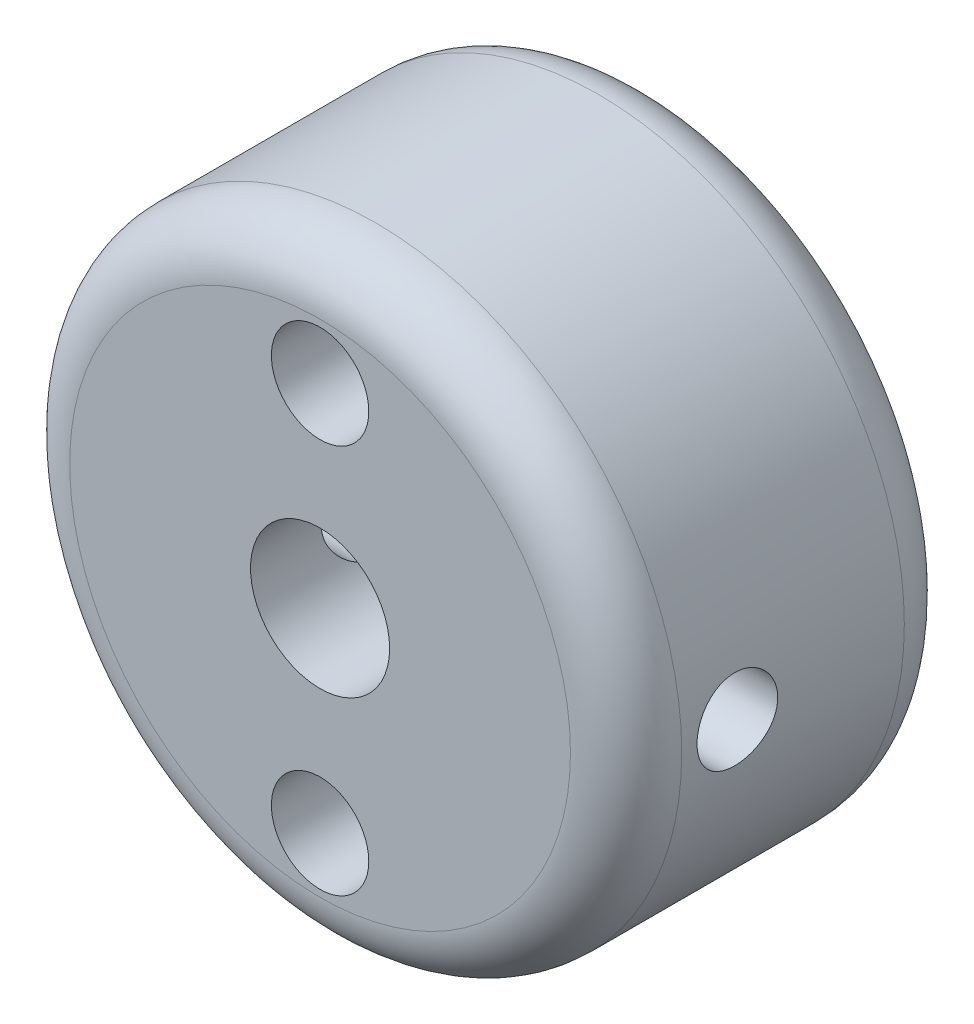
ISO-10303-21;
HEADER;
FILE_DESCRIPTION(('STEP AP214'),'2;1');
FILE_NAME('part.step','',(''),(''),'','','');
FILE_SCHEMA(('AUTOMOTIVE_DESIGN { 1 0 10303 214 1 1 1 1 }'));
ENDSEC;
DATA;
#1=APPLICATION_CONTEXT('core data for automotive mechanical design processes');
#2=APPLICATION_PROTOCOL_DEFINITION('international standard','automotive_design',2000,#1);
#3=PRODUCT_CONTEXT('',#1,'mechanical');
#4=PRODUCT('Part','Part','',(#3));
#5=PRODUCT_RELATED_PRODUCT_CATEGORY('part','',(#4));
#6=PRODUCT_DEFINITION_FORMATION('','',#4);
#7=PRODUCT_DEFINITION_CONTEXT('part definition',#1,'design');
#8=PRODUCT_DEFINITION('design','',#6,#7);
#9=PRODUCT_DEFINITION_SHAPE('','',#8);
#10=(LENGTH_UNIT() NAMED_UNIT(*) SI_UNIT(.MILLI.,.METRE.));
#11=(NAMED_UNIT(*) PLANE_ANGLE_UNIT() SI_UNIT($,.RADIAN.));
#12=(NAMED_UNIT(*) SI_UNIT($,.STERADIAN.) SOLID_ANGLE_UNIT());
#13=UNCERTAINTY_MEASURE_WITH_UNIT(LENGTH_MEASURE(1.E-05),#10,'distance_accuracy_value','');
#14=(GEOMETRIC_REPRESENTATION_CONTEXT(3) GLOBAL_UNCERTAINTY_ASSIGNED_CONTEXT((#13)) GLOBAL_UNIT_ASSIGNED_CONTEXT((#10,
#11,#12)) REPRESENTATION_CONTEXT('',''));
#15=CARTESIAN_POINT('',(0.,0.,0.));
#16=DIRECTION('',(0.,0.,1.));
#17=DIRECTION('',(1.,0.,0.));
#18=AXIS2_PLACEMENT_3D('',#15,#16,#17);
#19=CARTESIAN_POINT('',(0.,0.,12.));
#20=DIRECTION('',(0.,0.,-1.));
#21=DIRECTION('',(-1.,0.,0.));
#22=AXIS2_PLACEMENT_3D('',#19,#20,#21);
#23=CYLINDRICAL_SURFACE('',#22,11.);
#24=CARTESIAN_POINT('',(0.,0.,2.));
#25=DIRECTION('',(0.,0.,1.));
#26=DIRECTION('',(1.,0.,0.));
#27=AXIS2_PLACEMENT_3D('',#24,#25,#26);
#28=CIRCLE('',#27,11.);
#29=CARTESIAN_POINT('',(11.,0.,2.));
#30=VERTEX_POINT('',#29);
#31=EDGE_CURVE('E46',#30,#30,#28,.T.);
#32=ORIENTED_EDGE('',*,*,#31,.T.);
#33=EDGE_LOOP('',(#32));
#34=FACE_BOUND('',#33,.T.);
#35=CARTESIAN_POINT('',(0.,0.,10.));
#36=DIRECTION('',(0.,0.,1.));
#37=DIRECTION('',(1.,0.,0.));
#38=AXIS2_PLACEMENT_3D('',#35,#36,#37);
#39=CIRCLE('',#38,11.);
#40=CARTESIAN_POINT('',(11.,0.,10.));
#41=VERTEX_POINT('',#40);
#42=EDGE_CURVE('E50',#41,#41,#39,.F.);
#43=ORIENTED_EDGE('',*,*,#42,.T.);
#44=EDGE_LOOP('',(#43));
#45=FACE_BOUND('',#44,.T.);
#46=CARTESIAN_POINT('',(-11.,0.,6.55));
#47=CARTESIAN_POINT('',(-10.9999988196388,0.0810700646171393,6.55000342051961));
#48=CARTESIAN_POINT('',(-10.9990943229053,0.162189868877602,6.55682192032503));
#49=CARTESIAN_POINT('',(-10.9955731202661,0.322169605437502,6.58391315314188));
#50=CARTESIAN_POINT('',(-10.9929546573158,0.401027131913437,6.60419969300054));
#51=CARTESIAN_POINT('',(-10.9863003210212,0.554143323078767,6.65761671049998));
#52=CARTESIAN_POINT('',(-10.9822654320346,0.628405139545536,6.6907382699875));
#53=CARTESIAN_POINT('',(-10.9732262610622,0.770303018771588,6.76886501147568));
#54=CARTESIAN_POINT('',(-10.9682221372676,0.837940160051304,6.81386825467285));
#55=CARTESIAN_POINT('',(-10.9577685262702,0.965094397524424,6.91477387526258));
#56=CARTESIAN_POINT('',(-10.9523167626944,1.02456528084474,6.97073425703771));
#57=CARTESIAN_POINT('',(-10.9416005348791,1.13330064962176,7.09184100218557));
#58=CARTESIAN_POINT('',(-10.9363360804959,1.18256459863647,7.15698784806557));
#59=CARTESIAN_POINT('',(-10.9265682378684,1.26966190957159,7.29492131419906));
#60=CARTESIAN_POINT('',(-10.9220677857385,1.30745159484514,7.36773573969019));
#61=CARTESIAN_POINT('',(-10.9143678475705,1.37024869470427,7.51874678877762));
#62=CARTESIAN_POINT('',(-10.9111683067632,1.39525664741921,7.59694318562786));
#63=CARTESIAN_POINT('',(-10.9064543923123,1.43163912912521,7.75601702054221));
#64=CARTESIAN_POINT('',(-10.9049303392818,1.44309199636364,7.83687624962315));
#65=CARTESIAN_POINT('',(-10.9037104090596,1.45228167982049,7.99938226110222));
#66=CARTESIAN_POINT('',(-10.9040144503748,1.4500191074473,8.0810290082323));
#67=CARTESIAN_POINT('',(-10.9064074983364,1.43190636958793,8.24224456855266));
#68=CARTESIAN_POINT('',(-10.9084851368854,1.41614273874349,8.32182329681115));
#69=CARTESIAN_POINT('',(-10.9141735456992,1.37161048448269,8.47719608118436));
#70=CARTESIAN_POINT('',(-10.9177843501963,1.34284157068583,8.55299005275151));
#71=CARTESIAN_POINT('',(-10.9261450516096,1.27302315482551,8.69890922463832));
#72=CARTESIAN_POINT('',(-10.9308984051033,1.23193629190835,8.76901634265197));
#73=CARTESIAN_POINT('',(-10.9410059978065,1.1386749782748,8.90137349380902));
#74=CARTESIAN_POINT('',(-10.9463602675537,1.08649996395346,8.96362312730411));
#75=CARTESIAN_POINT('',(-10.9571168626766,0.972064992456455,9.0790003578433));
#76=CARTESIAN_POINT('',(-10.9625192406978,0.909730494064861,9.13205404548237));
#77=CARTESIAN_POINT('',(-10.9727248548317,0.777001989824109,9.22695708797897));
#78=CARTESIAN_POINT('',(-10.9775280892857,0.70660796166477,9.2688064118198));
#79=CARTESIAN_POINT('',(-10.9859976882221,0.559699827335735,9.34011378323897));
#80=CARTESIAN_POINT('',(-10.9896636028473,0.483183314483563,9.36956692925241));
#81=CARTESIAN_POINT('',(-10.9954415298472,0.326231477719914,9.41518578764115));
#82=CARTESIAN_POINT('',(-10.997553623177,0.245796358202938,9.43135219226844));
#83=CARTESIAN_POINT('',(-10.9999753597285,0.0839293214855447,9.44984223716992));
#84=CARTESIAN_POINT('',(-11.0002982527661,0.0025092190009183,9.45226763863529));
#85=CARTESIAN_POINT('',(-10.9991410564284,-0.159576341881272,9.44347577522623));
#86=CARTESIAN_POINT('',(-10.9976610098596,-0.240241818149795,9.43225883425634));
#87=CARTESIAN_POINT('',(-10.9930724672379,-0.398226029883761,9.39658525683905));
#88=CARTESIAN_POINT('',(-10.9899699737374,-0.475555971843567,9.37217741160519));
#89=CARTESIAN_POINT('',(-10.9824837081492,-0.625025328682233,9.31086578614261));
#90=CARTESIAN_POINT('',(-10.9780998881678,-0.697164549415324,9.27396153881192));
#91=CARTESIAN_POINT('',(-10.9685062679801,-0.834657390373671,9.18846039037535));
#92=CARTESIAN_POINT('',(-10.9632918985135,-0.899969953544018,9.13979798782221));
#93=CARTESIAN_POINT('',(-10.9526340584351,-1.02153712511859,9.03225416318574));
#94=CARTESIAN_POINT('',(-10.9471905776756,-1.07779133177993,8.97337228810392));
#95=CARTESIAN_POINT('',(-10.9366468548114,-1.1800083558422,8.84661145626795));
#96=CARTESIAN_POINT('',(-10.9315490130966,-1.22590351912656,8.77867771571363));
#97=CARTESIAN_POINT('',(-10.9223140367197,-1.30563155012618,8.63600606279097));
#98=CARTESIAN_POINT('',(-10.9181768810082,-1.33946468213883,8.56126829955414));
#99=CARTESIAN_POINT('',(-10.9113483388595,-1.39399990531041,8.40732418761388));
#100=CARTESIAN_POINT('',(-10.9086528277334,-1.41473948946965,8.3281313117656));
#101=CARTESIAN_POINT('',(-10.9050011700211,-1.44261930498135,8.16734898032797));
#102=CARTESIAN_POINT('',(-10.9040449326706,-1.44976024598175,8.08575965002372));
#103=CARTESIAN_POINT('',(-10.9039829338122,-1.45022606159318,7.92317378599637));
#104=CARTESIAN_POINT('',(-10.9048629343521,-1.4436572398525,7.84217754184687));
#105=CARTESIAN_POINT('',(-10.9083435624851,-1.41711579165026,7.6824513797019));
#106=CARTESIAN_POINT('',(-10.9109441895948,-1.39714316895594,7.60372146106946));
#107=CARTESIAN_POINT('',(-10.9175684950974,-1.34439544632631,7.4507807749069));
#108=CARTESIAN_POINT('',(-10.9215915378437,-1.31162606430288,7.37656800609609));
#109=CARTESIAN_POINT('',(-10.9306083506385,-1.23422547164092,7.23467717142674));
#110=CARTESIAN_POINT('',(-10.9356021382087,-1.18959404689068,7.1669992235528));
#111=CARTESIAN_POINT('',(-10.9460440978656,-1.08934387085847,7.03955651235548));
#112=CARTESIAN_POINT('',(-10.9514953687448,-1.03364599113853,6.97985424254895));
#113=CARTESIAN_POINT('',(-10.96221108401,-0.913009987436894,6.87060382925458));
#114=CARTESIAN_POINT('',(-10.9674754842283,-0.848069696902254,6.82105807326282));
#115=CARTESIAN_POINT('',(-10.9772491210592,-0.710475153456872,6.7333462763053));
#116=CARTESIAN_POINT('',(-10.9817550751133,-0.637789486027496,6.69522916983561));
#117=CARTESIAN_POINT('',(-10.9894712322809,-0.48702809962841,6.63179768741467));
#118=CARTESIAN_POINT('',(-10.992682825891,-0.408958270914869,6.60646956516244));
#119=CARTESIAN_POINT('',(-10.9966846065157,-0.275414672613428,6.57531766397778));
#120=CARTESIAN_POINT('',(-10.9979217393459,-0.220778830682095,6.56583740166495));
#121=CARTESIAN_POINT('',(-10.9995798358821,-0.110769729790444,6.55317742793763));
#122=CARTESIAN_POINT('',(-11.0000008065597,-0.0553964771331876,6.54999766270402));
#123=CARTESIAN_POINT('',(-11.,0.,6.55));
#124=B_SPLINE_CURVE_WITH_KNOTS('',3,(#46,#47,#48,#49,#50,#51,#52,#53,#54,#55,#56,#57,#58,#59,
#60,#61,#62,#63,#64,#65,#66,#67,#68,#69,#70,#71,#72,#73,#74,#75,#76,#77,#78,#79,#80,#81,#82,#83,
#84,#85,#86,#87,#88,#89,#90,#91,#92,#93,#94,#95,#96,#97,#98,#99,#100,#101,#102,#103,#104,#105,
#106,#107,#108,#109,#110,#111,#112,#113,#114,#115,#116,#117,#118,#119,#120,#121,#122,#123),
.UNSPECIFIED.,.T.,.F.,(4,2,2,2,2,2,2,2,2,2,2,2,2,2,2,2,2,2,2,2,2,2,2,2,2,2,2,2,2,2,2,2,2,2,2,2,
2,2,4),(0.,0.243007828473049,0.4862651634519,0.729353778194148,0.972402751241188,
1.21677495909267,1.46116000706599,1.70646396695275,1.95175759833839,2.19562658431033,
2.43948469914337,2.68179141020091,2.92410353172262,3.16715816197606,3.41022514952563,
3.65516324515727,3.90010201883658,4.14513755281857,4.39016031940414,4.63336613485026,
4.87656617607309,5.1188727521352,5.3611883863547,5.60488634486559,5.84859510853436,
6.09385220859557,6.33910393437143,6.58365016502282,6.82818363362987,7.07082806913886,
7.31347243645079,7.55600850802209,7.79854895770433,8.04289046043343,8.28728933492577,
8.53272018932119,8.77788667661282,8.94393924693374,9.10999039882029),.UNSPECIFIED.);
#125=CARTESIAN_POINT('',(-11.,0.,6.55));
#126=VERTEX_POINT('',#125);
#127=EDGE_CURVE('E90',#126,#126,#124,.T.);
#128=ORIENTED_EDGE('',*,*,#127,.T.);
#129=EDGE_LOOP('',(#128));
#130=FACE_BOUND('',#129,.T.);
#131=CARTESIAN_POINT('',(11.,0.,6.55));
#132=CARTESIAN_POINT('',(10.9999988196388,-0.0810700646171393,6.55000342051961));
#133=CARTESIAN_POINT('',(10.9990943229053,-0.162189868877602,6.55682192032503));
#134=CARTESIAN_POINT('',(10.9955731202661,-0.322169605437502,6.58391315314188));
#135=CARTESIAN_POINT('',(10.9929546573158,-0.401027131913437,6.60419969300054));
#136=CARTESIAN_POINT('',(10.9863003210212,-0.554143323078767,6.65761671049998));
#137=CARTESIAN_POINT('',(10.9822654320346,-0.628405139545536,6.6907382699875));
#138=CARTESIAN_POINT('',(10.9732262610622,-0.770303018771588,6.76886501147568));
#139=CARTESIAN_POINT('',(10.9682221372676,-0.837940160051304,6.81386825467285));
#140=CARTESIAN_POINT('',(10.9577685262702,-0.965094397524424,6.91477387526258));
#141=CARTESIAN_POINT('',(10.9523167626944,-1.02456528084474,6.97073425703771));
#142=CARTESIAN_POINT('',(10.9416005348791,-1.13330064962176,7.09184100218557));
#143=CARTESIAN_POINT('',(10.9363360804959,-1.18256459863647,7.15698784806557));
#144=CARTESIAN_POINT('',(10.9265682378684,-1.26966190957159,7.29492131419906));
#145=CARTESIAN_POINT('',(10.9220677857385,-1.30745159484514,7.36773573969019));
#146=CARTESIAN_POINT('',(10.9143678475705,-1.37024869470427,7.51874678877762));
#147=CARTESIAN_POINT('',(10.9111683067632,-1.39525664741921,7.59694318562786));
#148=CARTESIAN_POINT('',(10.9064543923123,-1.43163912912521,7.75601702054221));
#149=CARTESIAN_POINT('',(10.9049303392818,-1.44309199636364,7.83687624962315));
#150=CARTESIAN_POINT('',(10.9037104090596,-1.45228167982049,7.99938226110222));
#151=CARTESIAN_POINT('',(10.9040144503748,-1.4500191074473,8.0810290082323));
#152=CARTESIAN_POINT('',(10.9064074983364,-1.43190636958793,8.24224456855266));
#153=CARTESIAN_POINT('',(10.9084851368854,-1.41614273874349,8.32182329681115));
#154=CARTESIAN_POINT('',(10.9141735456992,-1.37161048448269,8.47719608118436));
#155=CARTESIAN_POINT('',(10.9177843501963,-1.34284157068583,8.55299005275151));
#156=CARTESIAN_POINT('',(10.9261450516096,-1.27302315482551,8.69890922463832));
#157=CARTESIAN_POINT('',(10.9308984051033,-1.23193629190835,8.76901634265197));
#158=CARTESIAN_POINT('',(10.9410059978065,-1.1386749782748,8.90137349380902));
#159=CARTESIAN_POINT('',(10.9463602675537,-1.08649996395346,8.96362312730411));
#160=CARTESIAN_POINT('',(10.9571168626766,-0.972064992456455,9.0790003578433));
#161=CARTESIAN_POINT('',(10.9625192406978,-0.909730494064861,9.13205404548237));
#162=CARTESIAN_POINT('',(10.9727248548317,-0.777001989824109,9.22695708797897));
#163=CARTESIAN_POINT('',(10.9775280892857,-0.70660796166477,9.2688064118198));
#164=CARTESIAN_POINT('',(10.9859976882221,-0.559699827335735,9.34011378323897));
#165=CARTESIAN_POINT('',(10.9896636028473,-0.483183314483563,9.36956692925241));
#166=CARTESIAN_POINT('',(10.9954415298472,-0.326231477719914,9.41518578764115));
#167=CARTESIAN_POINT('',(10.997553623177,-0.245796358202938,9.43135219226844));
#168=CARTESIAN_POINT('',(10.9999753597285,-0.0839293214855447,9.44984223716992));
#169=CARTESIAN_POINT('',(11.0002982527661,-0.0025092190009183,9.45226763863529));
#170=CARTESIAN_POINT('',(10.9991410564284,0.159576341881272,9.44347577522623));
#171=CARTESIAN_POINT('',(10.9976610098596,0.240241818149795,9.43225883425634));
#172=CARTESIAN_POINT('',(10.9930724672379,0.398226029883761,9.39658525683905));
#173=CARTESIAN_POINT('',(10.9899699737374,0.475555971843567,9.37217741160519));
#174=CARTESIAN_POINT('',(10.9824837081492,0.625025328682233,9.31086578614261));
#175=CARTESIAN_POINT('',(10.9780998881678,0.697164549415324,9.27396153881192));
#176=CARTESIAN_POINT('',(10.9685062679801,0.834657390373671,9.18846039037535));
#177=CARTESIAN_POINT('',(10.9632918985135,0.899969953544018,9.13979798782221));
#178=CARTESIAN_POINT('',(10.9526340584351,1.02153712511859,9.03225416318574));
#179=CARTESIAN_POINT('',(10.9471905776756,1.07779133177993,8.97337228810392));
#180=CARTESIAN_POINT('',(10.9366468548114,1.1800083558422,8.84661145626795));
#181=CARTESIAN_POINT('',(10.9315490130966,1.22590351912656,8.77867771571363));
#182=CARTESIAN_POINT('',(10.9223140367197,1.30563155012618,8.63600606279097));
#183=CARTESIAN_POINT('',(10.9181768810082,1.33946468213883,8.56126829955414));
#184=CARTESIAN_POINT('',(10.9113483388595,1.39399990531041,8.40732418761388));
#185=CARTESIAN_POINT('',(10.9086528277334,1.41473948946965,8.3281313117656));
#186=CARTESIAN_POINT('',(10.9050011700211,1.44261930498135,8.16734898032797));
#187=CARTESIAN_POINT('',(10.9040449326706,1.44976024598175,8.08575965002372));
#188=CARTESIAN_POINT('',(10.9039829338122,1.45022606159318,7.92317378599637));
#189=CARTESIAN_POINT('',(10.9048629343521,1.4436572398525,7.84217754184687));
#190=CARTESIAN_POINT('',(10.9083435624851,1.41711579165026,7.6824513797019));
#191=CARTESIAN_POINT('',(10.9109441895948,1.39714316895594,7.60372146106946));
#192=CARTESIAN_POINT('',(10.9175684950974,1.34439544632631,7.4507807749069));
#193=CARTESIAN_POINT('',(10.9215915378437,1.31162606430288,7.37656800609609));
#194=CARTESIAN_POINT('',(10.9306083506385,1.23422547164092,7.23467717142674));
#195=CARTESIAN_POINT('',(10.9356021382087,1.18959404689068,7.1669992235528));
#196=CARTESIAN_POINT('',(10.9460440978656,1.08934387085847,7.03955651235548));
#197=CARTESIAN_POINT('',(10.9514953687448,1.03364599113853,6.97985424254895));
#198=CARTESIAN_POINT('',(10.96221108401,0.913009987436894,6.87060382925458));
#199=CARTESIAN_POINT('',(10.9674754842283,0.848069696902254,6.82105807326282));
#200=CARTESIAN_POINT('',(10.9772491210592,0.710475153456872,6.7333462763053));
#201=CARTESIAN_POINT('',(10.9817550751133,0.637789486027496,6.69522916983561));
#202=CARTESIAN_POINT('',(10.9894712322809,0.48702809962841,6.63179768741467));
#203=CARTESIAN_POINT('',(10.992682825891,0.408958270914869,6.60646956516244));
#204=CARTESIAN_POINT('',(10.9966846065157,0.275414672613428,6.57531766397778));
#205=CARTESIAN_POINT('',(10.9979217393459,0.220778830682095,6.56583740166495));
#206=CARTESIAN_POINT('',(10.9995798358821,0.110769729790444,6.55317742793763));
#207=CARTESIAN_POINT('',(11.0000008065597,0.0553964771331876,6.54999766270402));
#208=CARTESIAN_POINT('',(11.,0.,6.55));
#209=B_SPLINE_CURVE_WITH_KNOTS('',3,(#131,#132,#133,#134,#135,#136,#137,#138,#139,#140,#141,
#142,#143,#144,#145,#146,#147,#148,#149,#150,#151,#152,#153,#154,#155,#156,#157,#158,#159,#160,
#161,#162,#163,#164,#165,#166,#167,#168,#169,#170,#171,#172,#173,#174,#175,#176,#177,#178,#179,
#180,#181,#182,#183,#184,#185,#186,#187,#188,#189,#190,#191,#192,#193,#194,#195,#196,#197,#198,
#199,#200,#201,#202,#203,#204,#205,#206,#207,#208),.UNSPECIFIED.,.T.,.F.,(4,2,2,2,2,2,2,2,2,2,2,
2,2,2,2,2,2,2,2,2,2,2,2,2,2,2,2,2,2,2,2,2,2,2,2,2,2,2,4),(0.,0.243007828473049,0.4862651634519,
0.729353778194148,0.972402751241188,1.21677495909267,1.46116000706599,1.70646396695275,
1.95175759833839,2.19562658431033,2.43948469914337,2.68179141020091,2.92410353172262,
3.16715816197606,3.41022514952563,3.65516324515727,3.90010201883658,4.14513755281857,
4.39016031940414,4.63336613485026,4.87656617607309,5.1188727521352,5.3611883863547,
5.60488634486559,5.84859510853436,6.09385220859557,6.33910393437143,6.58365016502282,
6.82818363362987,7.07082806913886,7.31347243645079,7.55600850802209,7.79854895770433,
8.04289046043343,8.28728933492577,8.53272018932119,8.77788667661282,8.94393924693374,
9.10999039882029),.UNSPECIFIED.);
#210=CARTESIAN_POINT('',(11.,0.,6.55));
#211=VERTEX_POINT('',#210);
#212=EDGE_CURVE('E64',#211,#211,#209,.T.);
#213=ORIENTED_EDGE('',*,*,#212,.T.);
#214=EDGE_LOOP('',(#213));
#215=FACE_BOUND('',#214,.T.);
#216=ADVANCED_FACE('F35',(#34,#45,#130,#215),#23,.T.);
#217=CARTESIAN_POINT('',(0.,0.,12.));
#218=DIRECTION('',(0.,0.,1.));
#219=DIRECTION('',(1.,0.,0.));
#220=AXIS2_PLACEMENT_3D('',#217,#218,#219);
#221=PLANE('',#220);
#222=CARTESIAN_POINT('',(0.,0.,12.));
#223=DIRECTION('',(0.,0.,1.));
#224=DIRECTION('',(1.,0.,0.));
#225=AXIS2_PLACEMENT_3D('',#222,#223,#224);
#226=CIRCLE('',#225,9.);
#227=CARTESIAN_POINT('',(9.,0.,12.));
#228=VERTEX_POINT('',#227);
#229=EDGE_CURVE('E11',#228,#228,#226,.T.);
#230=ORIENTED_EDGE('',*,*,#229,.T.);
#231=EDGE_LOOP('',(#230));
#232=FACE_BOUND('',#231,.T.);
#233=CARTESIAN_POINT('',(0.,0.,12.));
#234=DIRECTION('',(0.,0.,1.));
#235=DIRECTION('',(1.,0.,0.));
#236=AXIS2_PLACEMENT_3D('',#233,#234,#235);
#237=CIRCLE('',#236,2.5);
#238=CARTESIAN_POINT('',(2.5,0.,12.));
#239=VERTEX_POINT('',#238);
#240=EDGE_CURVE('E123',#239,#239,#237,.T.);
#241=ORIENTED_EDGE('',*,*,#240,.F.);
#242=EDGE_LOOP('',(#241));
#243=FACE_BOUND('',#242,.T.);
#244=CARTESIAN_POINT('',(0.,7.,12.));
#245=DIRECTION('',(0.,0.,1.));
#246=DIRECTION('',(1.,0.,0.));
#247=AXIS2_PLACEMENT_3D('',#244,#245,#246);
#248=CIRCLE('',#247,1.75);
#249=CARTESIAN_POINT('',(1.75,7.,12.));
#250=VERTEX_POINT('',#249);
#251=EDGE_CURVE('E134',#250,#250,#248,.T.);
#252=ORIENTED_EDGE('',*,*,#251,.F.);
#253=EDGE_LOOP('',(#252));
#254=FACE_BOUND('',#253,.T.);
#255=CARTESIAN_POINT('',(0.,-7.,12.));
#256=DIRECTION('',(0.,0.,1.));
#257=DIRECTION('',(1.,0.,0.));
#258=AXIS2_PLACEMENT_3D('',#255,#256,#257);
#259=CIRCLE('',#258,1.75);
#260=CARTESIAN_POINT('',(1.75,-7.,12.));
#261=VERTEX_POINT('',#260);
#262=EDGE_CURVE('E129',#261,#261,#259,.T.);
#263=ORIENTED_EDGE('',*,*,#262,.F.);
#264=EDGE_LOOP('',(#263));
#265=FACE_BOUND('',#264,.T.);
#266=ADVANCED_FACE('F98',(#232,#243,#254,#265),#221,.T.);
#267=CARTESIAN_POINT('',(0.,0.,0.));
#268=DIRECTION('',(0.,0.,1.));
#269=DIRECTION('',(1.,0.,0.));
#270=AXIS2_PLACEMENT_3D('',#267,#268,#269);
#271=PLANE('',#270);
#272=CARTESIAN_POINT('',(0.,0.,0.));
#273=DIRECTION('',(0.,0.,1.));
#274=DIRECTION('',(1.,0.,0.));
#275=AXIS2_PLACEMENT_3D('',#272,#273,#274);
#276=CIRCLE('',#275,9.);
#277=CARTESIAN_POINT('',(9.,0.,0.));
#278=VERTEX_POINT('',#277);
#279=EDGE_CURVE('E42',#278,#278,#276,.F.);
#280=ORIENTED_EDGE('',*,*,#279,.T.);
#281=EDGE_LOOP('',(#280));
#282=FACE_BOUND('',#281,.T.);
#283=CARTESIAN_POINT('',(0.,7.,0.));
#284=DIRECTION('',(0.,0.,1.));
#285=DIRECTION('',(1.,0.,0.));
#286=AXIS2_PLACEMENT_3D('',#283,#284,#285);
#287=CIRCLE('',#286,1.75);
#288=CARTESIAN_POINT('',(1.75,7.,0.));
#289=VERTEX_POINT('',#288);
#290=EDGE_CURVE('E55',#289,#289,#287,.T.);
#291=ORIENTED_EDGE('',*,*,#290,.T.);
#292=EDGE_LOOP('',(#291));
#293=FACE_BOUND('',#292,.T.);
#294=CARTESIAN_POINT('',(0.,-7.,0.));
#295=DIRECTION('',(0.,0.,1.));
#296=DIRECTION('',(1.,0.,0.));
#297=AXIS2_PLACEMENT_3D('',#294,#295,#296);
#298=CIRCLE('',#297,1.75);
#299=CARTESIAN_POINT('',(1.75,-7.,0.));
#300=VERTEX_POINT('',#299);
#301=EDGE_CURVE('E137',#300,#300,#298,.T.);
#302=ORIENTED_EDGE('',*,*,#301,.T.);
#303=EDGE_LOOP('',(#302));
#304=FACE_BOUND('',#303,.T.);
#305=ADVANCED_FACE('F100',(#282,#293,#304),#271,.F.);
#306=CARTESIAN_POINT('',(0.,-7.,0.));
#307=DIRECTION('',(0.,0.,1.));
#308=DIRECTION('',(1.,0.,0.));
#309=AXIS2_PLACEMENT_3D('',#306,#307,#308);
#310=CYLINDRICAL_SURFACE('',#309,1.75);
#311=ORIENTED_EDGE('',*,*,#301,.F.);
#312=EDGE_LOOP('',(#311));
#313=FACE_BOUND('',#312,.T.);
#314=ORIENTED_EDGE('',*,*,#262,.T.);
#315=EDGE_LOOP('',(#314));
#316=FACE_BOUND('',#315,.T.);
#317=ADVANCED_FACE('F142',(#313,#316),#310,.F.);
#318=CARTESIAN_POINT('',(0.,7.,0.));
#319=DIRECTION('',(0.,0.,1.));
#320=DIRECTION('',(1.,0.,0.));
#321=AXIS2_PLACEMENT_3D('',#318,#319,#320);
#322=CYLINDRICAL_SURFACE('',#321,1.75);
#323=ORIENTED_EDGE('',*,*,#290,.F.);
#324=EDGE_LOOP('',(#323));
#325=FACE_BOUND('',#324,.T.);
#326=ORIENTED_EDGE('',*,*,#251,.T.);
#327=EDGE_LOOP('',(#326));
#328=FACE_BOUND('',#327,.T.);
#329=ADVANCED_FACE('F151',(#325,#328),#322,.F.);
#330=CARTESIAN_POINT('',(0.,0.,-7.07106781186547));
#331=DIRECTION('',(0.,0.,1.));
#332=DIRECTION('',(1.,0.,0.));
#333=AXIS2_PLACEMENT_3D('',#330,#331,#332);
#334=CYLINDRICAL_SURFACE('',#333,2.5);
#335=CARTESIAN_POINT('',(2.5,0.,6.55));
#336=CARTESIAN_POINT('',(2.49999608878618,0.0745983864942306,6.55000432696253));
#337=CARTESIAN_POINT('',(2.49662457567457,0.149313220442496,6.55579613762605));
#338=CARTESIAN_POINT('',(2.48346046339436,0.296504145264797,6.57867651490273));
#339=CARTESIAN_POINT('',(2.47365256454314,0.368974469890021,6.59579199937478));
#340=CARTESIAN_POINT('',(2.4486156545862,0.509248557083119,6.64038375893058));
#341=CARTESIAN_POINT('',(2.43341244952313,0.577072731220503,6.66781074998979));
#342=CARTESIAN_POINT('',(2.39889951819023,0.706968172974679,6.73195100062432));
#343=CARTESIAN_POINT('',(2.37959072338244,0.769040740917357,6.76866215419808));
#344=CARTESIAN_POINT('',(2.33685317235166,0.890832083619935,6.85334498058178));
#345=CARTESIAN_POINT('',(2.31322587824492,0.950042239373606,6.90194612360602));
#346=CARTESIAN_POINT('',(2.26496878972705,1.05996612005899,7.00763133234899));
#347=CARTESIAN_POINT('',(2.24033782242608,1.11066952826846,7.06472554220365));
#348=CARTESIAN_POINT('',(2.18957706579264,1.20792647957687,7.19338263143274));
#349=CARTESIAN_POINT('',(2.1635915191164,1.25336712430616,7.2658510836036));
#350=CARTESIAN_POINT('',(2.11657608479705,1.33123443984171,7.41891706136172));
#351=CARTESIAN_POINT('',(2.0955385515577,1.3636812437859,7.49950176693018));
#352=CARTESIAN_POINT('',(2.06580519081686,1.40818885397949,7.64777942805405));
#353=CARTESIAN_POINT('',(2.05539100837257,1.42320701480874,7.71423928479686));
#354=CARTESIAN_POINT('',(2.04101324301713,1.44375517427719,7.84926577655831));
#355=CARTESIAN_POINT('',(2.03704242743126,1.44929581180854,7.91782996122389));
#356=CARTESIAN_POINT('',(2.03612922095662,1.45057879307477,8.05520174108938));
#357=CARTESIAN_POINT('',(2.03919757736047,1.44630615404806,8.12400954813123));
#358=CARTESIAN_POINT('',(2.05192272478615,1.42819113507736,8.25974212131952));
#359=CARTESIAN_POINT('',(2.0615841785778,1.41434198233984,8.32666551987353));
#360=CARTESIAN_POINT('',(2.0861183536392,1.37789078204817,8.45655622675065));
#361=CARTESIAN_POINT('',(2.10095763601946,1.35534480311269,8.51954593312966));
#362=CARTESIAN_POINT('',(2.13424607783604,1.30229503426013,8.64103603251607));
#363=CARTESIAN_POINT('',(2.15269660122682,1.2717882361111,8.69953471761971));
#364=CARTESIAN_POINT('',(2.19480545542998,1.19788106725762,8.82061331348097));
#365=CARTESIAN_POINT('',(2.21882103285047,1.15318469222408,8.8822787585875));
#366=CARTESIAN_POINT('',(2.26725108306482,1.05479107399041,8.99783906376126));
#367=CARTESIAN_POINT('',(2.29166589153013,1.00108586350441,9.0517269663022));
#368=CARTESIAN_POINT('',(2.34163790885507,0.878422476840313,9.15678661379245));
#369=CARTESIAN_POINT('',(2.36697530758474,0.808404714600064,9.20683880259807));
#370=CARTESIAN_POINT('',(2.41272802094265,0.659395036320358,9.29427373148467));
#371=CARTESIAN_POINT('',(2.43314632659228,0.580408616823397,9.33166417609304));
#372=CARTESIAN_POINT('',(2.46551508620011,0.421164732532883,9.38989541954025));
#373=CARTESIAN_POINT('',(2.47794530595015,0.341355493071077,9.41168540970715));
#374=CARTESIAN_POINT('',(2.49496618851793,0.178405336293742,9.441356601549));
#375=CARTESIAN_POINT('',(2.49956505369197,0.0952679982998283,9.44925235597334));
#376=CARTESIAN_POINT('',(2.50032562577934,-0.0606624733643608,9.450559443564));
#377=CARTESIAN_POINT('',(2.49747452256236,-0.133443272000073,9.44566551582712));
#378=CARTESIAN_POINT('',(2.48565425030567,-0.276956086320476,9.42514836995409));
#379=CARTESIAN_POINT('',(2.47668503580421,-0.347688086777123,9.40952507209135));
#380=CARTESIAN_POINT('',(2.45361801789569,-0.484244934779021,9.36858369419832));
#381=CARTESIAN_POINT('',(2.43959467166841,-0.550125105936233,9.34340609637713));
#382=CARTESIAN_POINT('',(2.40754563527269,-0.676753391567145,9.28428664716367));
#383=CARTESIAN_POINT('',(2.38951903730118,-0.737500337677504,9.25034280759723));
#384=CARTESIAN_POINT('',(2.34876399274994,-0.858968918084638,9.1706772366594));
#385=CARTESIAN_POINT('',(2.32574125691677,-0.91902723088376,9.12409638571248));
#386=CARTESIAN_POINT('',(2.27834670397906,-1.03094047928564,9.02244174508993));
#387=CARTESIAN_POINT('',(2.25397334476034,-1.08278576561096,8.96735811347785));
#388=CARTESIAN_POINT('',(2.20317555091673,-1.18301684659096,8.84267436018118));
#389=CARTESIAN_POINT('',(2.17684586935574,-1.23028355632097,8.77212937278884));
#390=CARTESIAN_POINT('',(2.12846294684293,-1.31221835722543,8.62274842502313));
#391=CARTESIAN_POINT('',(2.10640432096765,-1.34690236147371,8.54392310054492));
#392=CARTESIAN_POINT('',(2.07400282763602,-1.39613323776793,8.39740701719303));
#393=CARTESIAN_POINT('',(2.06216072072272,-1.41340635178387,8.33096614344601));
#394=CARTESIAN_POINT('',(2.0448094132648,-1.43839944471993,8.19553525961715));
#395=CARTESIAN_POINT('',(2.03929252620778,-1.4461310195523,8.12654844890801));
#396=CARTESIAN_POINT('',(2.03539456478689,-1.45161381431829,7.98779709338589));
#397=CARTESIAN_POINT('',(2.0370312270633,-1.44934022717628,7.9180310437305));
#398=CARTESIAN_POINT('',(2.04722696309937,-1.43489884572277,7.78003357057393));
#399=CARTESIAN_POINT('',(2.05579032090652,-1.42272492819429,7.71180312366812));
#400=CARTESIAN_POINT('',(2.07832736484315,-1.38958224635531,7.58043196737925));
#401=CARTESIAN_POINT('',(2.09215535622502,-1.36884914974201,7.51720525059212));
#402=CARTESIAN_POINT('',(2.12368238869614,-1.31940532312123,7.39500437766779));
#403=CARTESIAN_POINT('',(2.1413828202649,-1.29069172654666,7.3360317591925));
#404=CARTESIAN_POINT('',(2.18198915351872,-1.2209784785712,7.21427359667413));
#405=CARTESIAN_POINT('',(2.20527671365975,-1.17876510801859,7.15231056225657));
#406=CARTESIAN_POINT('',(2.25265572471891,-1.08548717159302,7.03573976291863));
#407=CARTESIAN_POINT('',(2.27674789233208,-1.03441453493516,6.98113878614665));
#408=CARTESIAN_POINT('',(2.32688563395686,-0.916642577999451,6.8732892777476));
#409=CARTESIAN_POINT('',(2.35275132070779,-0.84876269019923,6.82123437328739));
#410=CARTESIAN_POINT('',(2.40010316170135,-0.703775326027777,6.7293522827671));
#411=CARTESIAN_POINT('',(2.42159178380368,-0.626673088507919,6.68951819996171));
#412=CARTESIAN_POINT('',(2.45449752913093,-0.479656740138418,6.62975933135951));
#413=CARTESIAN_POINT('',(2.46702769790981,-0.410915850862636,6.60755003707107));
#414=CARTESIAN_POINT('',(2.48635913520828,-0.270229542926965,6.57357765446952));
#415=CARTESIAN_POINT('',(2.49317623766332,-0.198293566924125,6.56178568926394));
#416=CARTESIAN_POINT('',(2.49788609128716,-0.104919574697088,6.55364756457086));
#417=CARTESIAN_POINT('',(2.49867744879041,-0.0839707410169183,6.5522812432271));
#418=CARTESIAN_POINT('',(2.49973499071194,-0.0420176897380365,6.55045678805937));
#419=CARTESIAN_POINT('',(2.50000110174171,-0.021013464810429,6.5499987811469));
#420=CARTESIAN_POINT('',(2.5,0.,6.55));
#421=B_SPLINE_CURVE_WITH_KNOTS('',3,(#335,#336,#337,#338,#339,#340,#341,#342,#343,#344,#345,
#346,#347,#348,#349,#350,#351,#352,#353,#354,#355,#356,#357,#358,#359,#360,#361,#362,#363,#364,
#365,#366,#367,#368,#369,#370,#371,#372,#373,#374,#375,#376,#377,#378,#379,#380,#381,#382,#383,
#384,#385,#386,#387,#388,#389,#390,#391,#392,#393,#394,#395,#396,#397,#398,#399,#400,#401,#402,
#403,#404,#405,#406,#407,#408,#409,#410,#411,#412,#413,#414,#415,#416,#417,#418,#419,#420),
.UNSPECIFIED.,.T.,.F.,(4,2,2,2,2,2,2,2,2,2,2,2,2,2,2,2,2,2,2,2,2,2,2,2,2,2,2,2,2,2,2,2,2,2,2,2,
2,2,2,2,2,2,4),(0.,0.223706982412245,0.447947665603368,0.671129937303743,0.894261628105654,
1.1337990118912,1.37362483161435,1.64049764231835,1.90695533550043,2.11284762814589,
2.31850864656275,2.52448387378999,2.73060492197312,2.93541873353626,3.14031005243757,
3.37894431278479,3.61779074141962,3.88556680494439,4.15317963576061,4.40267154686914,
4.6519019855763,4.86982800149358,5.08775563676791,5.30259587890443,5.51748488943188,
5.7547842245485,5.99236032142311,6.25780306371925,6.52290892634595,6.73101567614271,
6.93886926220977,7.1472384961884,7.35573670174663,7.55884111331097,7.76201857374999,
7.99664209934841,8.23148050023499,8.49825395194386,8.76487657358034,8.98391162746823,
9.20233759241276,9.26534434561922,9.32835990163437),.UNSPECIFIED.);
#422=CARTESIAN_POINT('',(2.5,0.,6.55));
#423=VERTEX_POINT('',#422);
#424=EDGE_CURVE('E56',#423,#423,#421,.T.);
#425=ORIENTED_EDGE('',*,*,#424,.T.);
#426=EDGE_LOOP('',(#425));
#427=FACE_BOUND('',#426,.T.);
#428=CARTESIAN_POINT('',(-2.5,0.,6.55));
#429=CARTESIAN_POINT('',(-2.49999608878618,-0.0745983864942306,6.55000432696253));
#430=CARTESIAN_POINT('',(-2.49662457567457,-0.149313220442496,6.55579613762605));
#431=CARTESIAN_POINT('',(-2.48346046339436,-0.296504145264797,6.57867651490273));
#432=CARTESIAN_POINT('',(-2.47365256454314,-0.368974469890021,6.59579199937478));
#433=CARTESIAN_POINT('',(-2.4486156545862,-0.509248557083119,6.64038375893058));
#434=CARTESIAN_POINT('',(-2.43341244952313,-0.577072731220503,6.66781074998979));
#435=CARTESIAN_POINT('',(-2.39889951819023,-0.706968172974679,6.73195100062432));
#436=CARTESIAN_POINT('',(-2.37959072338244,-0.769040740917357,6.76866215419808));
#437=CARTESIAN_POINT('',(-2.33685317235166,-0.890832083619935,6.85334498058178));
#438=CARTESIAN_POINT('',(-2.31322587824492,-0.950042239373606,6.90194612360602));
#439=CARTESIAN_POINT('',(-2.26496878972705,-1.05996612005899,7.00763133234899));
#440=CARTESIAN_POINT('',(-2.24033782242608,-1.11066952826846,7.06472554220365));
#441=CARTESIAN_POINT('',(-2.18957706579264,-1.20792647957687,7.19338263143274));
#442=CARTESIAN_POINT('',(-2.1635915191164,-1.25336712430616,7.2658510836036));
#443=CARTESIAN_POINT('',(-2.11657608479705,-1.33123443984171,7.41891706136172));
#444=CARTESIAN_POINT('',(-2.0955385515577,-1.3636812437859,7.49950176693018));
#445=CARTESIAN_POINT('',(-2.06580519081686,-1.40818885397949,7.64777942805405));
#446=CARTESIAN_POINT('',(-2.05539100837257,-1.42320701480874,7.71423928479686));
#447=CARTESIAN_POINT('',(-2.04101324301713,-1.44375517427719,7.84926577655831));
#448=CARTESIAN_POINT('',(-2.03704242743126,-1.44929581180854,7.91782996122389));
#449=CARTESIAN_POINT('',(-2.03612922095662,-1.45057879307477,8.05520174108938));
#450=CARTESIAN_POINT('',(-2.03919757736047,-1.44630615404806,8.12400954813123));
#451=CARTESIAN_POINT('',(-2.05192272478615,-1.42819113507736,8.25974212131952));
#452=CARTESIAN_POINT('',(-2.0615841785778,-1.41434198233984,8.32666551987353));
#453=CARTESIAN_POINT('',(-2.0861183536392,-1.37789078204817,8.45655622675065));
#454=CARTESIAN_POINT('',(-2.10095763601946,-1.35534480311269,8.51954593312966));
#455=CARTESIAN_POINT('',(-2.13424607783604,-1.30229503426013,8.64103603251607));
#456=CARTESIAN_POINT('',(-2.15269660122682,-1.2717882361111,8.69953471761971));
#457=CARTESIAN_POINT('',(-2.19480545542998,-1.19788106725762,8.82061331348097));
#458=CARTESIAN_POINT('',(-2.21882103285047,-1.15318469222408,8.8822787585875));
#459=CARTESIAN_POINT('',(-2.26725108306482,-1.05479107399041,8.99783906376126));
#460=CARTESIAN_POINT('',(-2.29166589153013,-1.00108586350441,9.0517269663022));
#461=CARTESIAN_POINT('',(-2.34163790885507,-0.878422476840313,9.15678661379245));
#462=CARTESIAN_POINT('',(-2.36697530758474,-0.808404714600064,9.20683880259807));
#463=CARTESIAN_POINT('',(-2.41272802094265,-0.659395036320358,9.29427373148467));
#464=CARTESIAN_POINT('',(-2.43314632659228,-0.580408616823397,9.33166417609304));
#465=CARTESIAN_POINT('',(-2.46551508620011,-0.421164732532883,9.38989541954025));
#466=CARTESIAN_POINT('',(-2.47794530595015,-0.341355493071077,9.41168540970715));
#467=CARTESIAN_POINT('',(-2.49496618851793,-0.178405336293742,9.441356601549));
#468=CARTESIAN_POINT('',(-2.49956505369197,-0.0952679982998283,9.44925235597334));
#469=CARTESIAN_POINT('',(-2.50032562577934,0.0606624733643608,9.450559443564));
#470=CARTESIAN_POINT('',(-2.49747452256236,0.133443272000073,9.44566551582712));
#471=CARTESIAN_POINT('',(-2.48565425030567,0.276956086320476,9.42514836995409));
#472=CARTESIAN_POINT('',(-2.47668503580421,0.347688086777123,9.40952507209135));
#473=CARTESIAN_POINT('',(-2.45361801789569,0.484244934779021,9.36858369419832));
#474=CARTESIAN_POINT('',(-2.43959467166841,0.550125105936233,9.34340609637713));
#475=CARTESIAN_POINT('',(-2.40754563527269,0.676753391567145,9.28428664716367));
#476=CARTESIAN_POINT('',(-2.38951903730118,0.737500337677504,9.25034280759723));
#477=CARTESIAN_POINT('',(-2.34876399274994,0.858968918084638,9.1706772366594));
#478=CARTESIAN_POINT('',(-2.32574125691677,0.91902723088376,9.12409638571248));
#479=CARTESIAN_POINT('',(-2.27834670397906,1.03094047928564,9.02244174508993));
#480=CARTESIAN_POINT('',(-2.25397334476034,1.08278576561096,8.96735811347785));
#481=CARTESIAN_POINT('',(-2.20317555091673,1.18301684659096,8.84267436018118));
#482=CARTESIAN_POINT('',(-2.17684586935574,1.23028355632097,8.77212937278884));
#483=CARTESIAN_POINT('',(-2.12846294684293,1.31221835722543,8.62274842502313));
#484=CARTESIAN_POINT('',(-2.10640432096765,1.34690236147371,8.54392310054492));
#485=CARTESIAN_POINT('',(-2.07400282763602,1.39613323776793,8.39740701719303));
#486=CARTESIAN_POINT('',(-2.06216072072272,1.41340635178387,8.33096614344601));
#487=CARTESIAN_POINT('',(-2.0448094132648,1.43839944471993,8.19553525961715));
#488=CARTESIAN_POINT('',(-2.03929252620778,1.4461310195523,8.12654844890801));
#489=CARTESIAN_POINT('',(-2.03539456478689,1.45161381431829,7.98779709338589));
#490=CARTESIAN_POINT('',(-2.0370312270633,1.44934022717628,7.9180310437305));
#491=CARTESIAN_POINT('',(-2.04722696309937,1.43489884572277,7.78003357057393));
#492=CARTESIAN_POINT('',(-2.05579032090652,1.42272492819429,7.71180312366812));
#493=CARTESIAN_POINT('',(-2.07832736484315,1.38958224635531,7.58043196737925));
#494=CARTESIAN_POINT('',(-2.09215535622502,1.36884914974201,7.51720525059212));
#495=CARTESIAN_POINT('',(-2.12368238869614,1.31940532312123,7.39500437766779));
#496=CARTESIAN_POINT('',(-2.1413828202649,1.29069172654666,7.3360317591925));
#497=CARTESIAN_POINT('',(-2.18198915351872,1.2209784785712,7.21427359667413));
#498=CARTESIAN_POINT('',(-2.20527671365975,1.17876510801859,7.15231056225657));
#499=CARTESIAN_POINT('',(-2.25265572471891,1.08548717159302,7.03573976291863));
#500=CARTESIAN_POINT('',(-2.27674789233208,1.03441453493516,6.98113878614665));
#501=CARTESIAN_POINT('',(-2.32688563395686,0.916642577999451,6.8732892777476));
#502=CARTESIAN_POINT('',(-2.35275132070779,0.84876269019923,6.82123437328739));
#503=CARTESIAN_POINT('',(-2.40010316170135,0.703775326027777,6.7293522827671));
#504=CARTESIAN_POINT('',(-2.42159178380368,0.626673088507919,6.68951819996171));
#505=CARTESIAN_POINT('',(-2.45449752913093,0.479656740138418,6.62975933135951));
#506=CARTESIAN_POINT('',(-2.46702769790981,0.410915850862636,6.60755003707107));
#507=CARTESIAN_POINT('',(-2.48635913520828,0.270229542926965,6.57357765446952));
#508=CARTESIAN_POINT('',(-2.49317623766332,0.198293566924125,6.56178568926394));
#509=CARTESIAN_POINT('',(-2.49788609128716,0.104919574697088,6.55364756457086));
#510=CARTESIAN_POINT('',(-2.49867744879041,0.0839707410169183,6.5522812432271));
#511=CARTESIAN_POINT('',(-2.49973499071194,0.0420176897380365,6.55045678805937));
#512=CARTESIAN_POINT('',(-2.50000110174171,0.021013464810429,6.5499987811469));
#513=CARTESIAN_POINT('',(-2.5,0.,6.55));
#514=B_SPLINE_CURVE_WITH_KNOTS('',3,(#428,#429,#430,#431,#432,#433,#434,#435,#436,#437,#438,
#439,#440,#441,#442,#443,#444,#445,#446,#447,#448,#449,#450,#451,#452,#453,#454,#455,#456,#457,
#458,#459,#460,#461,#462,#463,#464,#465,#466,#467,#468,#469,#470,#471,#472,#473,#474,#475,#476,
#477,#478,#479,#480,#481,#482,#483,#484,#485,#486,#487,#488,#489,#490,#491,#492,#493,#494,#495,
#496,#497,#498,#499,#500,#501,#502,#503,#504,#505,#506,#507,#508,#509,#510,#511,#512,#513),
.UNSPECIFIED.,.T.,.F.,(4,2,2,2,2,2,2,2,2,2,2,2,2,2,2,2,2,2,2,2,2,2,2,2,2,2,2,2,2,2,2,2,2,2,2,2,
2,2,2,2,2,2,4),(0.,0.223706982412245,0.447947665603368,0.671129937303743,0.894261628105654,
1.1337990118912,1.37362483161435,1.64049764231835,1.90695533550043,2.11284762814589,
2.31850864656275,2.52448387378999,2.73060492197312,2.93541873353626,3.14031005243757,
3.37894431278479,3.61779074141962,3.88556680494439,4.15317963576061,4.40267154686914,
4.6519019855763,4.86982800149358,5.08775563676791,5.30259587890443,5.51748488943188,
5.7547842245485,5.99236032142311,6.25780306371925,6.52290892634595,6.73101567614271,
6.93886926220977,7.1472384961884,7.35573670174663,7.55884111331097,7.76201857374999,
7.99664209934841,8.23148050023499,8.49825395194386,8.76487657358034,8.98391162746823,
9.20233759241276,9.26534434561922,9.32835990163437),.UNSPECIFIED.);
#515=CARTESIAN_POINT('',(-2.5,0.,6.55));
#516=VERTEX_POINT('',#515);
#517=EDGE_CURVE('E65',#516,#516,#514,.T.);
#518=ORIENTED_EDGE('',*,*,#517,.T.);
#519=EDGE_LOOP('',(#518));
#520=FACE_BOUND('',#519,.T.);
#521=CARTESIAN_POINT('',(0.,0.,2.));
#522=DIRECTION('',(0.,0.,1.));
#523=DIRECTION('',(1.,0.,0.));
#524=AXIS2_PLACEMENT_3D('',#521,#522,#523);
#525=CIRCLE('',#524,2.5);
#526=CARTESIAN_POINT('',(2.5,0.,2.));
#527=VERTEX_POINT('',#526);
#528=EDGE_CURVE('E125',#527,#527,#525,.F.);
#529=ORIENTED_EDGE('',*,*,#528,.T.);
#530=EDGE_LOOP('',(#529));
#531=FACE_BOUND('',#530,.T.);
#532=ORIENTED_EDGE('',*,*,#240,.T.);
#533=EDGE_LOOP('',(#532));
#534=FACE_BOUND('',#533,.T.);
#535=ADVANCED_FACE('F70',(#427,#520,#531,#534),#334,.F.);
#536=CARTESIAN_POINT('',(0.,0.,2.));
#537=DIRECTION('',(0.,0.,1.));
#538=DIRECTION('',(1.,0.,0.));
#539=AXIS2_PLACEMENT_3D('',#536,#537,#538);
#540=PLANE('',#539);
#541=ORIENTED_EDGE('',*,*,#528,.F.);
#542=EDGE_LOOP('',(#541));
#543=FACE_BOUND('',#542,.T.);
#544=ADVANCED_FACE('F78',(#543),#540,.T.);
#545=CARTESIAN_POINT('',(-11.,0.,8.));
#546=DIRECTION('',(1.,0.,0.));
#547=DIRECTION('',(0.,0.,-1.));
#548=AXIS2_PLACEMENT_3D('',#545,#546,#547);
#549=CYLINDRICAL_SURFACE('',#548,1.45);
#550=ORIENTED_EDGE('',*,*,#517,.F.);
#551=EDGE_LOOP('',(#550));
#552=FACE_BOUND('',#551,.T.);
#553=ORIENTED_EDGE('',*,*,#127,.F.);
#554=EDGE_LOOP('',(#553));
#555=FACE_BOUND('',#554,.T.);
#556=ADVANCED_FACE('F74',(#552,#555),#549,.F.);
#557=ORIENTED_EDGE('',*,*,#424,.F.);
#558=EDGE_LOOP('',(#557));
#559=FACE_BOUND('',#558,.T.);
#560=ORIENTED_EDGE('',*,*,#212,.F.);
#561=EDGE_LOOP('',(#560));
#562=FACE_BOUND('',#561,.T.);
#563=ADVANCED_FACE('F77',(#559,#562),#549,.F.);
#564=CARTESIAN_POINT('',(0.,0.,2.));
#565=DIRECTION('',(0.,0.,1.));
#566=DIRECTION('',(1.,0.,0.));
#567=AXIS2_PLACEMENT_3D('',#564,#565,#566);
#568=TOROIDAL_SURFACE('',#567,9.,2.);
#569=ORIENTED_EDGE('',*,*,#279,.F.);
#570=EDGE_LOOP('',(#569));
#571=FACE_BOUND('',#570,.T.);
#572=ORIENTED_EDGE('',*,*,#31,.F.);
#573=EDGE_LOOP('',(#572));
#574=FACE_BOUND('',#573,.T.);
#575=ADVANCED_FACE('F102',(#571,#574),#568,.T.);
#576=CARTESIAN_POINT('',(0.,0.,10.));
#577=DIRECTION('',(0.,0.,1.));
#578=DIRECTION('',(1.,0.,0.));
#579=AXIS2_PLACEMENT_3D('',#576,#577,#578);
#580=TOROIDAL_SURFACE('',#579,9.,2.);
#581=ORIENTED_EDGE('',*,*,#42,.F.);
#582=EDGE_LOOP('',(#581));
#583=FACE_BOUND('',#582,.T.);
#584=ORIENTED_EDGE('',*,*,#229,.F.);
#585=EDGE_LOOP('',(#584));
#586=FACE_BOUND('',#585,.T.);
#587=ADVANCED_FACE('F37',(#583,#586),#580,.T.);
#588=CLOSED_SHELL('',(#216,#266,#305,#317,#329,#535,#544,#556,#563,#575,#587));
#589=MANIFOLD_SOLID_BREP('B2',#588);
#590=ADVANCED_BREP_SHAPE_REPRESENTATION('',(#18,#589),#14);
#591=SHAPE_DEFINITION_REPRESENTATION(#9,#590);
ENDSEC;
END-ISO-10303-21;
